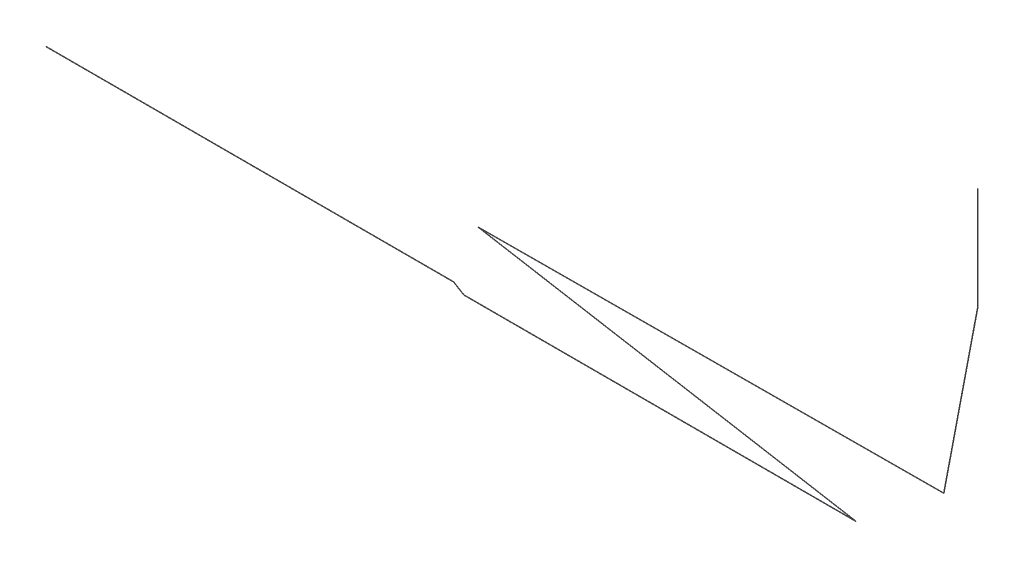
ISO-10303-21;
HEADER;
FILE_DESCRIPTION(('STEP AP214'),'2;1');
FILE_NAME('part.step','',(''),(''),'','','');
FILE_SCHEMA(('AUTOMOTIVE_DESIGN { 1 0 10303 214 1 1 1 1 }'));
ENDSEC;
DATA;
#1=APPLICATION_CONTEXT('core data for automotive mechanical design processes');
#2=APPLICATION_PROTOCOL_DEFINITION('international standard','automotive_design',2000,#1);
#3=PRODUCT_CONTEXT('',#1,'mechanical');
#4=PRODUCT('Part','Part','',(#3));
#5=PRODUCT_RELATED_PRODUCT_CATEGORY('part','',(#4));
#6=PRODUCT_DEFINITION_FORMATION('','',#4);
#7=PRODUCT_DEFINITION_CONTEXT('part definition',#1,'design');
#8=PRODUCT_DEFINITION('design','',#6,#7);
#9=PRODUCT_DEFINITION_SHAPE('','',#8);
#10=(LENGTH_UNIT() NAMED_UNIT(*) SI_UNIT(.MILLI.,.METRE.));
#11=(NAMED_UNIT(*) PLANE_ANGLE_UNIT() SI_UNIT($,.RADIAN.));
#12=(NAMED_UNIT(*) SI_UNIT($,.STERADIAN.) SOLID_ANGLE_UNIT());
#13=UNCERTAINTY_MEASURE_WITH_UNIT(LENGTH_MEASURE(1.E-05),#10,'distance_accuracy_value','');
#14=(GEOMETRIC_REPRESENTATION_CONTEXT(3) GLOBAL_UNCERTAINTY_ASSIGNED_CONTEXT((#13)) GLOBAL_UNIT_ASSIGNED_CONTEXT((#10,
#11,#12)) REPRESENTATION_CONTEXT('',''));
#15=CARTESIAN_POINT('',(0.,0.,0.));
#16=DIRECTION('',(0.,0.,1.));
#17=DIRECTION('',(1.,0.,0.));
#18=AXIS2_PLACEMENT_3D('',#15,#16,#17);
#19=CARTESIAN_POINT('',(-158.243172403469,80.0621015165063,0.));
#20=DIRECTION('',(0.98511343049485,-0.171905581813588,0.));
#21=DIRECTION('',(0.171905581813588,0.98511343049485,0.));
#22=AXIS2_PLACEMENT_3D('',#19,#20,#21);
#23=CYLINDRICAL_SURFACE('',#22,0.0999999999999991);
#24=CARTESIAN_POINT('',(22.9931962672129,48.4357502378873,0.));
#25=DIRECTION('',(0.98511343049485,-0.171905581813588,0.));
#26=DIRECTION('',(0.171905581813588,0.98511343049485,0.));
#27=AXIS2_PLACEMENT_3D('',#24,#25,#26);
#28=CIRCLE('',#27,0.0999999999999991);
#29=CARTESIAN_POINT('',(22.9931950749907,48.4357434057992,0.100000027282949));
#30=VERTEX_POINT('',#29);
#31=CARTESIAN_POINT('',(22.993196243985,48.4357501047788,-0.0999999994615925));
#32=VERTEX_POINT('',#31);
#33=EDGE_CURVE('E56',#30,#32,#28,.F.);
#34=ORIENTED_EDGE('',*,*,#33,.T.);
#35=CARTESIAN_POINT('',(22.9931962672129,48.4357502378873,0.));
#36=DIRECTION('',(0.0862744733543758,0.996271406418665,0.));
#37=DIRECTION('',(0.996271406418665,-0.0862744733543763,0.));
#38=AXIS2_PLACEMENT_3D('',#35,#36,#37);
#39=ELLIPSE('',#38,1.15909139878776,0.100000000000001);
#40=EDGE_CURVE('E76',#32,#30,#39,.T.);
#41=ORIENTED_EDGE('',*,*,#40,.T.);
#42=EDGE_LOOP('',(#34,#41));
#43=FACE_BOUND('',#42,.T.);
#44=CARTESIAN_POINT('',(-158.24317240347,80.0621015165064,0.));
#45=DIRECTION('',(-0.0837110601880687,-0.996490069394668,0.));
#46=DIRECTION('',(0.996490069394668,-0.083711060188069,0.));
#47=AXIS2_PLACEMENT_3D('',#44,#45,#46);
#48=ELLIPSE('',#47,1.12565310490697,0.0999999999999997);
#49=CARTESIAN_POINT('',(-158.243172403469,80.0621015165063,0.1));
#50=VERTEX_POINT('',#49);
#51=CARTESIAN_POINT('',(-158.243172403469,80.0621015165063,-0.0999999999999991));
#52=VERTEX_POINT('',#51);
#53=EDGE_CURVE('E68',#50,#52,#48,.F.);
#54=ORIENTED_EDGE('',*,*,#53,.F.);
#55=CARTESIAN_POINT('',(-158.243172403469,80.0621015165063,0.));
#56=DIRECTION('',(0.98511343049485,-0.171905581813588,0.));
#57=DIRECTION('',(0.171905581813588,0.98511343049485,0.));
#58=AXIS2_PLACEMENT_3D('',#55,#56,#57);
#59=CIRCLE('',#58,0.0999999999999991);
#60=EDGE_CURVE('E72',#52,#50,#59,.F.);
#61=ORIENTED_EDGE('',*,*,#60,.F.);
#62=EDGE_LOOP('',(#54,#61));
#63=FACE_BOUND('',#62,.T.);
#64=ADVANCED_FACE('F34',(#43,#63),#23,.T.);
#65=CARTESIAN_POINT('',(-158.243172403469,80.0621015165063,0.));
#66=DIRECTION('',(-0.98511343049485,0.171905581813588,0.));
#67=DIRECTION('',(-0.171905581813588,-0.98511343049485,0.));
#68=AXIS2_PLACEMENT_3D('',#65,#66,#67);
#69=PLANE('',#68);
#70=ORIENTED_EDGE('',*,*,#60,.T.);
#71=DIRECTION('',(0.,0.,-1.));
#72=VECTOR('',#71,1.);
#73=CARTESIAN_POINT('',(-158.243172403469,80.0621015165063,0.));
#74=LINE('',#73,#72);
#75=EDGE_CURVE('E12',#50,#52,#74,.T.);
#76=ORIENTED_EDGE('',*,*,#75,.T.);
#77=EDGE_LOOP('',(#70,#76));
#78=FACE_BOUND('',#77,.T.);
#79=ADVANCED_FACE('F75',(#78),#69,.T.);
#80=CARTESIAN_POINT('',(-165.232830436247,48.4357502378873,0.));
#81=DIRECTION('',(1.,0.,0.));
#82=DIRECTION('',(0.,0.,-1.));
#83=AXIS2_PLACEMENT_3D('',#80,#81,#82);
#84=CYLINDRICAL_SURFACE('',#83,0.100000000000003);
#85=CARTESIAN_POINT('',(-165.232830436247,48.4357502378873,0.));
#86=DIRECTION('',(0.963514098835059,-0.26765758226896,0.));
#87=DIRECTION('',(-0.26765758226896,-0.963514098835059,0.));
#88=AXIS2_PLACEMENT_3D('',#85,#86,#87);
#89=ELLIPSE('',#88,0.103786753220226,0.100000000000003);
#90=CARTESIAN_POINT('',(-165.260609747685,48.3357502378873,0.));
#91=VERTEX_POINT('',#90);
#92=EDGE_CURVE('E130',#91,#91,#89,.F.);
#93=ORIENTED_EDGE('',*,*,#92,.F.);
#94=EDGE_LOOP('',(#93));
#95=FACE_BOUND('',#94,.T.);
#96=ORIENTED_EDGE('',*,*,#40,.F.);
#97=CARTESIAN_POINT('',(22.9931962672129,48.4357502378873,0.100000000000003));
#98=CARTESIAN_POINT('',(22.9931962672129,48.3362585148526,0.0989781444189122));
#99=CARTESIAN_POINT('',(22.9931962672129,48.3357502378873,0.));
#100=CARTESIAN_POINT('',(22.9931962672129,48.3352420145352,-0.0989677041883999));
#101=CARTESIAN_POINT('',(22.9931962672129,48.4357502378873,-0.100000000000003));
#102=B_SPLINE_CURVE_WITH_KNOTS('',2,(#97,#98,#99,#100,#101),.UNSPECIFIED.,.F.,.F.,(3,2,3),(0.,
0.5,1.),.UNSPECIFIED.);
#103=EDGE_CURVE('E43',#30,#32,#102,.T.);
#104=ORIENTED_EDGE('',*,*,#103,.F.);
#105=EDGE_LOOP('',(#96,#104));
#106=FACE_BOUND('',#105,.T.);
#107=ADVANCED_FACE('F36',(#95,#106),#84,.T.);
#108=CARTESIAN_POINT('',(22.9931962672129,48.4357502378873,0.));
#109=DIRECTION('',(1.,0.,0.));
#110=DIRECTION('',(0.,0.,-1.));
#111=AXIS2_PLACEMENT_3D('',#108,#109,#110);
#112=PLANE('',#111);
#113=ORIENTED_EDGE('',*,*,#103,.T.);
#114=DIRECTION('',(0.,0.,1.));
#115=VECTOR('',#114,1.);
#116=CARTESIAN_POINT('',(22.9931962672129,48.4357502378873,0.));
#117=LINE('',#116,#115);
#118=EDGE_CURVE('E129',#32,#30,#117,.T.);
#119=ORIENTED_EDGE('',*,*,#118,.T.);
#120=EDGE_LOOP('',(#113,#119));
#121=FACE_BOUND('',#120,.T.);
#122=ADVANCED_FACE('F91',(#121),#112,.T.);
#123=CARTESIAN_POINT('',(-170.172447276116,51.409624256479,0.));
#124=DIRECTION('',(0.85671883730787,-0.515783708352495,0.));
#125=DIRECTION('',(0.515783708352495,0.85671883730787,0.));
#126=AXIS2_PLACEMENT_3D('',#123,#124,#125);
#127=CYLINDRICAL_SURFACE('',#126,0.100000000000003);
#128=CARTESIAN_POINT('',(-170.172447276116,51.409624256479,0.));
#129=DIRECTION('',(0.963514098835059,-0.26765758226896,0.));
#130=DIRECTION('',(-0.26765758226896,-0.963514098835059,0.));
#131=AXIS2_PLACEMENT_3D('',#128,#129,#130);
#132=ELLIPSE('',#131,0.103786753220226,0.100000000000003);
#133=CARTESIAN_POINT('',(-170.200226587554,51.309624256479,0.));
#134=VERTEX_POINT('',#133);
#135=EDGE_CURVE('E133',#134,#134,#132,.T.);
#136=ORIENTED_EDGE('',*,*,#135,.T.);
#137=EDGE_LOOP('',(#136));
#138=FACE_BOUND('',#137,.T.);
#139=ORIENTED_EDGE('',*,*,#92,.T.);
#140=EDGE_LOOP('',(#139));
#141=FACE_BOUND('',#140,.T.);
#142=ADVANCED_FACE('F101',(#138,#141),#127,.T.);
#143=CARTESIAN_POINT('',(-169.889604563641,51.409624256479,0.));
#144=DIRECTION('',(-1.,0.,0.));
#145=DIRECTION('',(0.,-1.,0.));
#146=AXIS2_PLACEMENT_3D('',#143,#144,#145);
#147=CYLINDRICAL_SURFACE('',#146,0.100000000000003);
#148=CARTESIAN_POINT('',(-365.725863356099,51.409624256479,0.));
#149=DIRECTION('',(1.,0.,0.));
#150=DIRECTION('',(0.,0.,-1.));
#151=AXIS2_PLACEMENT_3D('',#148,#149,#150);
#152=CIRCLE('',#151,0.100000000000003);
#153=CARTESIAN_POINT('',(-365.725863356099,51.409624256479,-0.100000000000003));
#154=VERTEX_POINT('',#153);
#155=EDGE_CURVE('E77',#154,#154,#152,.T.);
#156=ORIENTED_EDGE('',*,*,#155,.T.);
#157=EDGE_LOOP('',(#156));
#158=FACE_BOUND('',#157,.T.);
#159=ORIENTED_EDGE('',*,*,#135,.F.);
#160=EDGE_LOOP('',(#159));
#161=FACE_BOUND('',#160,.T.);
#162=ADVANCED_FACE('F108',(#158,#161),#147,.T.);
#163=CARTESIAN_POINT('',(-365.725863356099,51.409624256479,0.));
#164=DIRECTION('',(1.,0.,0.));
#165=DIRECTION('',(0.,0.,-1.));
#166=AXIS2_PLACEMENT_3D('',#163,#164,#165);
#167=PLANE('',#166);
#168=ORIENTED_EDGE('',*,*,#155,.F.);
#169=EDGE_LOOP('',(#168));
#170=FACE_BOUND('',#169,.T.);
#171=ADVANCED_FACE('F104',(#170),#167,.F.);
#172=CARTESIAN_POINT('',(22.9931962672129,48.4357502378873,0.));
#173=DIRECTION('',(-0.98511343049485,0.171905581813588,0.));
#174=DIRECTION('',(-0.171905581813588,-0.98511343049485,0.));
#175=AXIS2_PLACEMENT_3D('',#172,#173,#174);
#176=PLANE('',#175);
#177=ORIENTED_EDGE('',*,*,#118,.F.);
#178=ORIENTED_EDGE('',*,*,#33,.F.);
#179=EDGE_LOOP('',(#177,#178));
#180=FACE_BOUND('',#179,.T.);
#181=ADVANCED_FACE('F107',(#180),#176,.F.);
#182=CARTESIAN_POINT('',(65.4462825184628,81.2130937352767,0.));
#183=DIRECTION('',(-0.999986762220788,-0.00514542351847197,0.));
#184=DIRECTION('',(0.00514542351847197,-0.999986762220788,0.));
#185=AXIS2_PLACEMENT_3D('',#182,#183,#184);
#186=CYLINDRICAL_SURFACE('',#185,0.1);
#187=CARTESIAN_POINT('',(65.1634435501975,81.2116383897319,0.));
#188=DIRECTION('',(0.768833829249906,0.639448624207549,0.));
#189=DIRECTION('',(-0.639448624207549,0.768833829249906,0.));
#190=AXIS2_PLACEMENT_3D('',#187,#188,#189);
#191=ELLIPSE('',#190,0.129514572741998,0.1);
#192=CARTESIAN_POINT('',(65.0806256348428,81.3112135746368,0.));
#193=VERTEX_POINT('',#192);
#194=EDGE_CURVE('E69',#193,#193,#191,.T.);
#195=ORIENTED_EDGE('',*,*,#194,.F.);
#196=EDGE_LOOP('',(#195));
#197=FACE_BOUND('',#196,.T.);
#198=CARTESIAN_POINT('',(-158.243172403469,80.0621015165063,0.));
#199=DIRECTION('',(0.999986762220788,0.00514542351847197,0.));
#200=DIRECTION('',(-0.00514542351847197,0.999986762220788,0.));
#201=AXIS2_PLACEMENT_3D('',#198,#199,#200);
#202=CIRCLE('',#201,0.1);
#203=EDGE_CURVE('E49',#52,#50,#202,.T.);
#204=ORIENTED_EDGE('',*,*,#203,.T.);
#205=ORIENTED_EDGE('',*,*,#53,.T.);
#206=EDGE_LOOP('',(#204,#205));
#207=FACE_BOUND('',#206,.T.);
#208=ADVANCED_FACE('F67',(#197,#207),#186,.T.);
#209=CARTESIAN_POINT('',(81.4370441370305,166.574438036465,0.));
#210=DIRECTION('',(0.,1.,0.));
#211=DIRECTION('',(0.,0.,1.));
#212=AXIS2_PLACEMENT_3D('',#209,#210,#211);
#213=CYLINDRICAL_SURFACE('',#212,0.1);
#214=CARTESIAN_POINT('',(81.4370441370305,166.574438036465,0.));
#215=DIRECTION('',(0.0940507835634972,0.995567401088993,0.));
#216=DIRECTION('',(0.995567401088993,-0.0940507835634972,0.));
#217=AXIS2_PLACEMENT_3D('',#214,#215,#216);
#218=ELLIPSE('',#217,0.100445233432328,0.1);
#219=CARTESIAN_POINT('',(81.5370441370305,166.564991083555,0.));
#220=VERTEX_POINT('',#219);
#221=EDGE_CURVE('E152',#220,#220,#218,.F.);
#222=ORIENTED_EDGE('',*,*,#221,.F.);
#223=EDGE_LOOP('',(#222));
#224=FACE_BOUND('',#223,.T.);
#225=CARTESIAN_POINT('',(81.4370441370305,215.96800914331,0.));
#226=DIRECTION('',(0.,1.,0.));
#227=DIRECTION('',(0.,0.,1.));
#228=AXIS2_PLACEMENT_3D('',#225,#226,#227);
#229=CIRCLE('',#228,0.1);
#230=CARTESIAN_POINT('',(81.4370441370305,215.96800914331,0.1));
#231=VERTEX_POINT('',#230);
#232=EDGE_CURVE('E73',#231,#231,#229,.T.);
#233=ORIENTED_EDGE('',*,*,#232,.F.);
#234=EDGE_LOOP('',(#233));
#235=FACE_BOUND('',#234,.T.);
#236=ADVANCED_FACE('F162',(#224,#235),#213,.T.);
#237=CARTESIAN_POINT('',(65.1634435501975,81.2116383897319,0.));
#238=DIRECTION('',(0.187267788325389,0.982308900222184,0.));
#239=DIRECTION('',(-0.982308900222184,0.187267788325389,0.));
#240=AXIS2_PLACEMENT_3D('',#237,#238,#239);
#241=CYLINDRICAL_SURFACE('',#240,0.1);
#242=ORIENTED_EDGE('',*,*,#194,.T.);
#243=EDGE_LOOP('',(#242));
#244=FACE_BOUND('',#243,.T.);
#245=ORIENTED_EDGE('',*,*,#221,.T.);
#246=EDGE_LOOP('',(#245));
#247=FACE_BOUND('',#246,.T.);
#248=ADVANCED_FACE('F158',(#244,#247),#241,.T.);
#249=CARTESIAN_POINT('',(-158.243172403469,80.0621015165063,0.));
#250=DIRECTION('',(0.999986762220788,0.00514542351847197,0.));
#251=DIRECTION('',(-0.00514542351847197,0.999986762220788,0.));
#252=AXIS2_PLACEMENT_3D('',#249,#250,#251);
#253=PLANE('',#252);
#254=ORIENTED_EDGE('',*,*,#75,.F.);
#255=ORIENTED_EDGE('',*,*,#203,.F.);
#256=EDGE_LOOP('',(#254,#255));
#257=FACE_BOUND('',#256,.T.);
#258=ADVANCED_FACE('F61',(#257),#253,.F.);
#259=CARTESIAN_POINT('',(81.4370441370305,215.96800914331,0.));
#260=DIRECTION('',(0.,1.,0.));
#261=DIRECTION('',(0.,0.,1.));
#262=AXIS2_PLACEMENT_3D('',#259,#260,#261);
#263=PLANE('',#262);
#264=ORIENTED_EDGE('',*,*,#232,.T.);
#265=EDGE_LOOP('',(#264));
#266=FACE_BOUND('',#265,.T.);
#267=ADVANCED_FACE('F177',(#266),#263,.T.);
#268=CLOSED_SHELL('',(#64,#79,#107,#122,#142,#162,#171,#181,#208,#236,#248,#258,#267));
#269=MANIFOLD_SOLID_BREP('B2',#268);
#270=ADVANCED_BREP_SHAPE_REPRESENTATION('',(#18,#269),#14);
#271=SHAPE_DEFINITION_REPRESENTATION(#9,#270);
ENDSEC;
END-ISO-10303-21;
